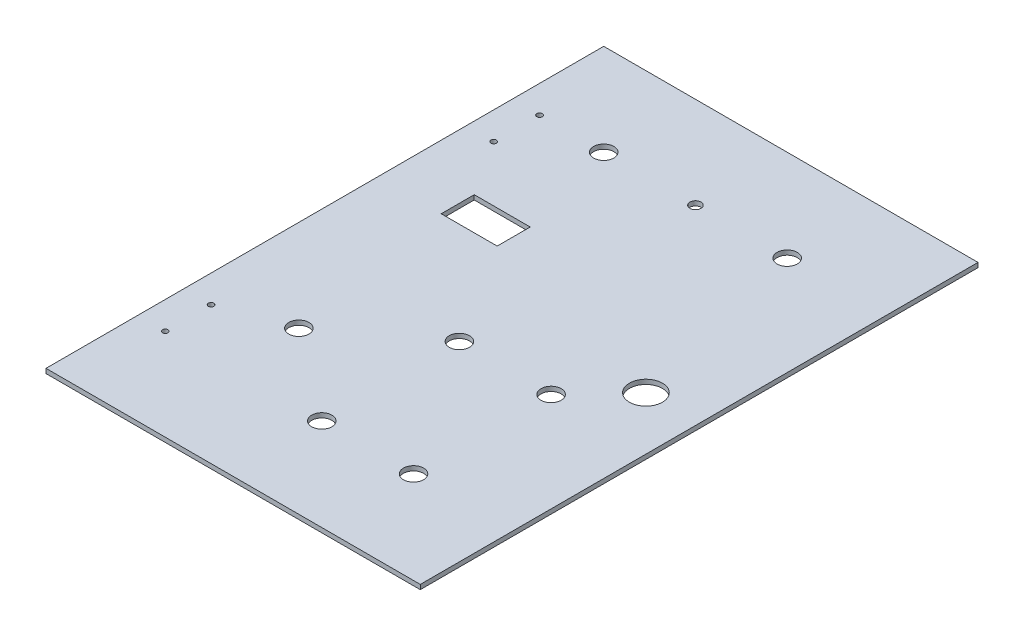
ISO-10303-21;
HEADER;
FILE_DESCRIPTION(('STEP AP214'),'2;1');
FILE_NAME('part.step','',(''),(''),'','','');
FILE_SCHEMA(('AUTOMOTIVE_DESIGN { 1 0 10303 214 1 1 1 1 }'));
ENDSEC;
DATA;
#1=APPLICATION_CONTEXT('core data for automotive mechanical design processes');
#2=APPLICATION_PROTOCOL_DEFINITION('international standard','automotive_design',2000,#1);
#3=PRODUCT_CONTEXT('',#1,'mechanical');
#4=PRODUCT('Part','Part','',(#3));
#5=PRODUCT_RELATED_PRODUCT_CATEGORY('part','',(#4));
#6=PRODUCT_DEFINITION_FORMATION('','',#4);
#7=PRODUCT_DEFINITION_CONTEXT('part definition',#1,'design');
#8=PRODUCT_DEFINITION('design','',#6,#7);
#9=PRODUCT_DEFINITION_SHAPE('','',#8);
#10=(LENGTH_UNIT() NAMED_UNIT(*) SI_UNIT(.MILLI.,.METRE.));
#11=(NAMED_UNIT(*) PLANE_ANGLE_UNIT() SI_UNIT($,.RADIAN.));
#12=(NAMED_UNIT(*) SI_UNIT($,.STERADIAN.) SOLID_ANGLE_UNIT());
#13=UNCERTAINTY_MEASURE_WITH_UNIT(LENGTH_MEASURE(1.E-05),#10,'distance_accuracy_value','');
#14=(GEOMETRIC_REPRESENTATION_CONTEXT(3) GLOBAL_UNCERTAINTY_ASSIGNED_CONTEXT((#13)) GLOBAL_UNIT_ASSIGNED_CONTEXT((#10,
#11,#12)) REPRESENTATION_CONTEXT('',''));
#15=CARTESIAN_POINT('',(0.,0.,0.));
#16=DIRECTION('',(0.,0.,1.));
#17=DIRECTION('',(1.,0.,0.));
#18=AXIS2_PLACEMENT_3D('',#15,#16,#17);
#19=CARTESIAN_POINT('',(-4.,21.6210946474568,-204.));
#20=DIRECTION('',(0.,-1.,0.));
#21=DIRECTION('',(0.,0.,-1.));
#22=AXIS2_PLACEMENT_3D('',#19,#20,#21);
#23=CYLINDRICAL_SURFACE('',#22,6.);
#24=CARTESIAN_POINT('',(-4.,0.,-204.));
#25=DIRECTION('',(0.,1.,0.));
#26=DIRECTION('',(0.,0.,-1.));
#27=AXIS2_PLACEMENT_3D('',#24,#25,#26);
#28=CIRCLE('',#27,6.);
#29=CARTESIAN_POINT('',(-4.,0.,-210.));
#30=VERTEX_POINT('',#29);
#31=EDGE_CURVE('E168',#30,#30,#28,.T.);
#32=ORIENTED_EDGE('',*,*,#31,.T.);
#33=EDGE_LOOP('',(#32));
#34=FACE_BOUND('',#33,.T.);
#35=CARTESIAN_POINT('',(-4.,-5.,-204.));
#36=DIRECTION('',(0.,1.,0.));
#37=DIRECTION('',(1.,0.,0.));
#38=AXIS2_PLACEMENT_3D('',#35,#36,#37);
#39=CIRCLE('',#38,6.);
#40=CARTESIAN_POINT('',(2.,-5.,-204.));
#41=VERTEX_POINT('',#40);
#42=EDGE_CURVE('E293',#41,#41,#39,.T.);
#43=ORIENTED_EDGE('',*,*,#42,.F.);
#44=EDGE_LOOP('',(#43));
#45=FACE_BOUND('',#44,.T.);
#46=ADVANCED_FACE('F15',(#34,#45),#23,.F.);
#47=CARTESIAN_POINT('',(146.,62.4678959301809,0.));
#48=DIRECTION('',(0.,-1.,0.));
#49=DIRECTION('',(0.,0.,-1.));
#50=AXIS2_PLACEMENT_3D('',#47,#48,#49);
#51=CYLINDRICAL_SURFACE('',#50,18.);
#52=CARTESIAN_POINT('',(146.,0.,0.));
#53=DIRECTION('',(0.,1.,0.));
#54=DIRECTION('',(0.,0.,-1.));
#55=AXIS2_PLACEMENT_3D('',#52,#53,#54);
#56=CIRCLE('',#55,18.);
#57=CARTESIAN_POINT('',(146.,0.,-18.));
#58=VERTEX_POINT('',#57);
#59=EDGE_CURVE('E181',#58,#58,#56,.T.);
#60=ORIENTED_EDGE('',*,*,#59,.T.);
#61=EDGE_LOOP('',(#60));
#62=FACE_BOUND('',#61,.T.);
#63=CARTESIAN_POINT('',(146.,-5.,0.));
#64=DIRECTION('',(0.,1.,0.));
#65=DIRECTION('',(1.,0.,0.));
#66=AXIS2_PLACEMENT_3D('',#63,#64,#65);
#67=CIRCLE('',#66,18.);
#68=CARTESIAN_POINT('',(164.,-5.,0.));
#69=VERTEX_POINT('',#68);
#70=EDGE_CURVE('E300',#69,#69,#67,.T.);
#71=ORIENTED_EDGE('',*,*,#70,.F.);
#72=EDGE_LOOP('',(#71));
#73=FACE_BOUND('',#72,.T.);
#74=ADVANCED_FACE('F283',(#62,#73),#51,.F.);
#75=CARTESIAN_POINT('',(96.,28.6663649179957,-204.));
#76=DIRECTION('',(0.,-1.,0.));
#77=DIRECTION('',(0.,0.,-1.));
#78=AXIS2_PLACEMENT_3D('',#75,#76,#77);
#79=CYLINDRICAL_SURFACE('',#78,11.);
#80=CARTESIAN_POINT('',(96.,0.,-204.));
#81=DIRECTION('',(0.,1.,0.));
#82=DIRECTION('',(0.,0.,-1.));
#83=AXIS2_PLACEMENT_3D('',#80,#81,#82);
#84=CIRCLE('',#83,11.);
#85=CARTESIAN_POINT('',(96.,0.,-215.));
#86=VERTEX_POINT('',#85);
#87=EDGE_CURVE('E184',#86,#86,#84,.T.);
#88=ORIENTED_EDGE('',*,*,#87,.T.);
#89=EDGE_LOOP('',(#88));
#90=FACE_BOUND('',#89,.T.);
#91=CARTESIAN_POINT('',(96.,-5.,-204.));
#92=DIRECTION('',(0.,1.,0.));
#93=DIRECTION('',(1.,0.,0.));
#94=AXIS2_PLACEMENT_3D('',#91,#92,#93);
#95=CIRCLE('',#94,11.);
#96=CARTESIAN_POINT('',(107.,-5.,-204.));
#97=VERTEX_POINT('',#96);
#98=EDGE_CURVE('E308',#97,#97,#95,.T.);
#99=ORIENTED_EDGE('',*,*,#98,.F.);
#100=EDGE_LOOP('',(#99));
#101=FACE_BOUND('',#100,.T.);
#102=ADVANCED_FACE('F287',(#90,#101),#79,.F.);
#103=CARTESIAN_POINT('',(-104.,55.4933006146598,-204.));
#104=DIRECTION('',(0.,-1.,0.));
#105=DIRECTION('',(0.,0.,-1.));
#106=AXIS2_PLACEMENT_3D('',#103,#104,#105);
#107=CYLINDRICAL_SURFACE('',#106,11.);
#108=CARTESIAN_POINT('',(-104.,0.,-204.));
#109=DIRECTION('',(0.,1.,0.));
#110=DIRECTION('',(0.,0.,-1.));
#111=AXIS2_PLACEMENT_3D('',#108,#109,#110);
#112=CIRCLE('',#111,11.);
#113=CARTESIAN_POINT('',(-104.,0.,-215.));
#114=VERTEX_POINT('',#113);
#115=EDGE_CURVE('E185',#114,#114,#112,.T.);
#116=ORIENTED_EDGE('',*,*,#115,.T.);
#117=EDGE_LOOP('',(#116));
#118=FACE_BOUND('',#117,.T.);
#119=CARTESIAN_POINT('',(-104.,-5.,-204.));
#120=DIRECTION('',(0.,1.,0.));
#121=DIRECTION('',(1.,0.,0.));
#122=AXIS2_PLACEMENT_3D('',#119,#120,#121);
#123=CIRCLE('',#122,11.);
#124=CARTESIAN_POINT('',(-93.,-5.,-204.));
#125=VERTEX_POINT('',#124);
#126=EDGE_CURVE('E315',#125,#125,#123,.T.);
#127=ORIENTED_EDGE('',*,*,#126,.F.);
#128=EDGE_LOOP('',(#127));
#129=FACE_BOUND('',#128,.T.);
#130=ADVANCED_FACE('F517',(#118,#129),#107,.F.);
#131=CARTESIAN_POINT('',(-174.,-23.3022716526502,-204.));
#132=DIRECTION('',(0.,1.,0.));
#133=DIRECTION('',(0.,0.,1.));
#134=AXIS2_PLACEMENT_3D('',#131,#132,#133);
#135=CYLINDRICAL_SURFACE('',#134,3.);
#136=CARTESIAN_POINT('',(-174.,0.,-204.));
#137=DIRECTION('',(0.,-1.,0.));
#138=DIRECTION('',(-1.,0.,0.));
#139=AXIS2_PLACEMENT_3D('',#136,#137,#138);
#140=CIRCLE('',#139,3.);
#141=CARTESIAN_POINT('',(-177.,0.,-204.));
#142=VERTEX_POINT('',#141);
#143=EDGE_CURVE('E188',#142,#142,#140,.T.);
#144=ORIENTED_EDGE('',*,*,#143,.F.);
#145=EDGE_LOOP('',(#144));
#146=FACE_BOUND('',#145,.T.);
#147=CARTESIAN_POINT('',(-174.,-5.,-204.));
#148=DIRECTION('',(0.,1.,0.));
#149=DIRECTION('',(0.,0.,-1.));
#150=AXIS2_PLACEMENT_3D('',#147,#148,#149);
#151=CIRCLE('',#150,3.);
#152=CARTESIAN_POINT('',(-174.,-5.,-207.));
#153=VERTEX_POINT('',#152);
#154=EDGE_CURVE('E319',#153,#153,#151,.T.);
#155=ORIENTED_EDGE('',*,*,#154,.F.);
#156=EDGE_LOOP('',(#155));
#157=FACE_BOUND('',#156,.T.);
#158=ADVANCED_FACE('F514',(#146,#157),#135,.F.);
#159=CARTESIAN_POINT('',(-174.,-23.7601065070478,-154.));
#160=DIRECTION('',(0.,1.,0.));
#161=DIRECTION('',(0.,0.,1.));
#162=AXIS2_PLACEMENT_3D('',#159,#160,#161);
#163=CYLINDRICAL_SURFACE('',#162,3.);
#164=CARTESIAN_POINT('',(-174.,0.,-154.));
#165=DIRECTION('',(0.,-1.,0.));
#166=DIRECTION('',(-1.,0.,0.));
#167=AXIS2_PLACEMENT_3D('',#164,#165,#166);
#168=CIRCLE('',#167,3.);
#169=CARTESIAN_POINT('',(-177.,0.,-154.));
#170=VERTEX_POINT('',#169);
#171=EDGE_CURVE('E193',#170,#170,#168,.T.);
#172=ORIENTED_EDGE('',*,*,#171,.F.);
#173=EDGE_LOOP('',(#172));
#174=FACE_BOUND('',#173,.T.);
#175=CARTESIAN_POINT('',(-174.,-5.,-154.));
#176=DIRECTION('',(0.,1.,0.));
#177=DIRECTION('',(0.,0.,-1.));
#178=AXIS2_PLACEMENT_3D('',#175,#176,#177);
#179=CIRCLE('',#178,3.);
#180=CARTESIAN_POINT('',(-174.,-5.,-157.));
#181=VERTEX_POINT('',#180);
#182=EDGE_CURVE('E323',#181,#181,#179,.T.);
#183=ORIENTED_EDGE('',*,*,#182,.F.);
#184=EDGE_LOOP('',(#183));
#185=FACE_BOUND('',#184,.T.);
#186=ADVANCED_FACE('F512',(#174,#185),#163,.F.);
#187=CARTESIAN_POINT('',(-174.,-23.6541691203319,154.));
#188=DIRECTION('',(0.,1.,0.));
#189=DIRECTION('',(0.,0.,1.));
#190=AXIS2_PLACEMENT_3D('',#187,#188,#189);
#191=CYLINDRICAL_SURFACE('',#190,3.);
#192=CARTESIAN_POINT('',(-174.,0.,154.));
#193=DIRECTION('',(0.,-1.,0.));
#194=DIRECTION('',(-1.,0.,0.));
#195=AXIS2_PLACEMENT_3D('',#192,#193,#194);
#196=CIRCLE('',#195,3.);
#197=CARTESIAN_POINT('',(-177.,0.,154.));
#198=VERTEX_POINT('',#197);
#199=EDGE_CURVE('E196',#198,#198,#196,.T.);
#200=ORIENTED_EDGE('',*,*,#199,.F.);
#201=EDGE_LOOP('',(#200));
#202=FACE_BOUND('',#201,.T.);
#203=CARTESIAN_POINT('',(-174.,-5.,154.));
#204=DIRECTION('',(0.,1.,0.));
#205=DIRECTION('',(0.,0.,-1.));
#206=AXIS2_PLACEMENT_3D('',#203,#204,#205);
#207=CIRCLE('',#206,3.);
#208=CARTESIAN_POINT('',(-174.,-5.,151.));
#209=VERTEX_POINT('',#208);
#210=EDGE_CURVE('E320',#209,#209,#207,.T.);
#211=ORIENTED_EDGE('',*,*,#210,.F.);
#212=EDGE_LOOP('',(#211));
#213=FACE_BOUND('',#212,.T.);
#214=ADVANCED_FACE('F508',(#202,#213),#191,.F.);
#215=CARTESIAN_POINT('',(-174.,-20.8355103007079,204.));
#216=DIRECTION('',(0.,1.,0.));
#217=DIRECTION('',(0.,0.,1.));
#218=AXIS2_PLACEMENT_3D('',#215,#216,#217);
#219=CYLINDRICAL_SURFACE('',#218,3.);
#220=CARTESIAN_POINT('',(-174.,0.,204.));
#221=DIRECTION('',(0.,-1.,0.));
#222=DIRECTION('',(-1.,0.,0.));
#223=AXIS2_PLACEMENT_3D('',#220,#221,#222);
#224=CIRCLE('',#223,3.);
#225=CARTESIAN_POINT('',(-177.,0.,204.));
#226=VERTEX_POINT('',#225);
#227=EDGE_CURVE('E199',#226,#226,#224,.T.);
#228=ORIENTED_EDGE('',*,*,#227,.F.);
#229=EDGE_LOOP('',(#228));
#230=FACE_BOUND('',#229,.T.);
#231=CARTESIAN_POINT('',(-174.,-5.,204.));
#232=DIRECTION('',(0.,1.,0.));
#233=DIRECTION('',(0.,0.,-1.));
#234=AXIS2_PLACEMENT_3D('',#231,#232,#233);
#235=CIRCLE('',#234,3.);
#236=CARTESIAN_POINT('',(-174.,-5.,201.));
#237=VERTEX_POINT('',#236);
#238=EDGE_CURVE('E253',#237,#237,#235,.T.);
#239=ORIENTED_EDGE('',*,*,#238,.F.);
#240=EDGE_LOOP('',(#239));
#241=FACE_BOUND('',#240,.T.);
#242=ADVANCED_FACE('F406',(#230,#241),#219,.F.);
#243=CARTESIAN_POINT('',(-104.,13.9804384099059,128.344438571223));
#244=DIRECTION('',(0.,-1.,0.));
#245=DIRECTION('',(0.,0.,-1.));
#246=AXIS2_PLACEMENT_3D('',#243,#244,#245);
#247=CYLINDRICAL_SURFACE('',#246,11.);
#248=CARTESIAN_POINT('',(-104.,0.,128.344438571223));
#249=DIRECTION('',(0.,1.,0.));
#250=DIRECTION('',(0.,0.,-1.));
#251=AXIS2_PLACEMENT_3D('',#248,#249,#250);
#252=CIRCLE('',#251,11.);
#253=CARTESIAN_POINT('',(-104.,0.,117.344438571223));
#254=VERTEX_POINT('',#253);
#255=EDGE_CURVE('E202',#254,#254,#252,.T.);
#256=ORIENTED_EDGE('',*,*,#255,.T.);
#257=EDGE_LOOP('',(#256));
#258=FACE_BOUND('',#257,.T.);
#259=CARTESIAN_POINT('',(-104.,-5.,128.344438571223));
#260=DIRECTION('',(0.,1.,0.));
#261=DIRECTION('',(1.,0.,0.));
#262=AXIS2_PLACEMENT_3D('',#259,#260,#261);
#263=CIRCLE('',#262,11.);
#264=CARTESIAN_POINT('',(-93.,-5.,128.344438571223));
#265=VERTEX_POINT('',#264);
#266=EDGE_CURVE('E255',#265,#265,#263,.T.);
#267=ORIENTED_EDGE('',*,*,#266,.F.);
#268=EDGE_LOOP('',(#267));
#269=FACE_BOUND('',#268,.T.);
#270=ADVANCED_FACE('F402',(#258,#269),#247,.F.);
#271=CARTESIAN_POINT('',(96.,29.0395615849271,53.3444385712235));
#272=DIRECTION('',(0.,-1.,0.));
#273=DIRECTION('',(0.,0.,-1.));
#274=AXIS2_PLACEMENT_3D('',#271,#272,#273);
#275=CYLINDRICAL_SURFACE('',#274,11.);
#276=CARTESIAN_POINT('',(96.,0.,53.3444385712235));
#277=DIRECTION('',(0.,1.,0.));
#278=DIRECTION('',(0.,0.,-1.));
#279=AXIS2_PLACEMENT_3D('',#276,#277,#278);
#280=CIRCLE('',#279,11.);
#281=CARTESIAN_POINT('',(96.,0.,42.3444385712235));
#282=VERTEX_POINT('',#281);
#283=EDGE_CURVE('E203',#282,#282,#280,.T.);
#284=ORIENTED_EDGE('',*,*,#283,.T.);
#285=EDGE_LOOP('',(#284));
#286=FACE_BOUND('',#285,.T.);
#287=CARTESIAN_POINT('',(96.,-5.,53.3444385712235));
#288=DIRECTION('',(0.,1.,0.));
#289=DIRECTION('',(-1.,0.,0.));
#290=AXIS2_PLACEMENT_3D('',#287,#288,#289);
#291=CIRCLE('',#290,11.);
#292=CARTESIAN_POINT('',(85.,-5.,53.3444385712235));
#293=VERTEX_POINT('',#292);
#294=EDGE_CURVE('E259',#293,#293,#291,.T.);
#295=ORIENTED_EDGE('',*,*,#294,.F.);
#296=EDGE_LOOP('',(#295));
#297=FACE_BOUND('',#296,.T.);
#298=ADVANCED_FACE('F405',(#286,#297),#275,.F.);
#299=CARTESIAN_POINT('',(-4.,98.1331984889527,53.3444385712235));
#300=DIRECTION('',(0.,-1.,0.));
#301=DIRECTION('',(0.,0.,-1.));
#302=AXIS2_PLACEMENT_3D('',#299,#300,#301);
#303=CYLINDRICAL_SURFACE('',#302,11.);
#304=CARTESIAN_POINT('',(-4.,0.,53.3444385712235));
#305=DIRECTION('',(0.,1.,0.));
#306=DIRECTION('',(0.,0.,-1.));
#307=AXIS2_PLACEMENT_3D('',#304,#305,#306);
#308=CIRCLE('',#307,11.);
#309=CARTESIAN_POINT('',(-4.,0.,42.3444385712235));
#310=VERTEX_POINT('',#309);
#311=EDGE_CURVE('E207',#310,#310,#308,.T.);
#312=ORIENTED_EDGE('',*,*,#311,.T.);
#313=EDGE_LOOP('',(#312));
#314=FACE_BOUND('',#313,.T.);
#315=CARTESIAN_POINT('',(-4.,-5.,53.3444385712235));
#316=DIRECTION('',(0.,1.,0.));
#317=DIRECTION('',(1.,0.,0.));
#318=AXIS2_PLACEMENT_3D('',#315,#316,#317);
#319=CIRCLE('',#318,11.);
#320=CARTESIAN_POINT('',(7.,-5.,53.3444385712235));
#321=VERTEX_POINT('',#320);
#322=EDGE_CURVE('E263',#321,#321,#319,.T.);
#323=ORIENTED_EDGE('',*,*,#322,.F.);
#324=EDGE_LOOP('',(#323));
#325=FACE_BOUND('',#324,.T.);
#326=ADVANCED_FACE('F499',(#314,#325),#303,.F.);
#327=CARTESIAN_POINT('',(96.,58.7076540386802,203.344438571223));
#328=DIRECTION('',(0.,-1.,0.));
#329=DIRECTION('',(0.,0.,-1.));
#330=AXIS2_PLACEMENT_3D('',#327,#328,#329);
#331=CYLINDRICAL_SURFACE('',#330,11.);
#332=CARTESIAN_POINT('',(96.,0.,203.344438571223));
#333=DIRECTION('',(0.,1.,0.));
#334=DIRECTION('',(0.,0.,-1.));
#335=AXIS2_PLACEMENT_3D('',#332,#333,#334);
#336=CIRCLE('',#335,11.);
#337=CARTESIAN_POINT('',(96.,0.,192.344438571223));
#338=VERTEX_POINT('',#337);
#339=EDGE_CURVE('E149',#338,#338,#336,.T.);
#340=ORIENTED_EDGE('',*,*,#339,.T.);
#341=EDGE_LOOP('',(#340));
#342=FACE_BOUND('',#341,.T.);
#343=CARTESIAN_POINT('',(96.,-5.,203.344438571223));
#344=DIRECTION('',(0.,1.,0.));
#345=DIRECTION('',(1.,0.,0.));
#346=AXIS2_PLACEMENT_3D('',#343,#344,#345);
#347=CIRCLE('',#346,11.);
#348=CARTESIAN_POINT('',(107.,-5.,203.344438571223));
#349=VERTEX_POINT('',#348);
#350=EDGE_CURVE('E267',#349,#349,#347,.T.);
#351=ORIENTED_EDGE('',*,*,#350,.F.);
#352=EDGE_LOOP('',(#351));
#353=FACE_BOUND('',#352,.T.);
#354=ADVANCED_FACE('F214',(#342,#353),#331,.F.);
#355=CARTESIAN_POINT('',(-4.,71.844398148231,203.344438571223));
#356=DIRECTION('',(0.,-1.,0.));
#357=DIRECTION('',(0.,0.,-1.));
#358=AXIS2_PLACEMENT_3D('',#355,#356,#357);
#359=CYLINDRICAL_SURFACE('',#358,11.);
#360=CARTESIAN_POINT('',(-4.,0.,203.344438571223));
#361=DIRECTION('',(0.,1.,0.));
#362=DIRECTION('',(0.,0.,-1.));
#363=AXIS2_PLACEMENT_3D('',#360,#361,#362);
#364=CIRCLE('',#363,11.);
#365=CARTESIAN_POINT('',(-4.,0.,192.344438571223));
#366=VERTEX_POINT('',#365);
#367=EDGE_CURVE('E141',#366,#366,#364,.T.);
#368=ORIENTED_EDGE('',*,*,#367,.T.);
#369=EDGE_LOOP('',(#368));
#370=FACE_BOUND('',#369,.T.);
#371=CARTESIAN_POINT('',(-4.,-5.,203.344438571223));
#372=DIRECTION('',(0.,1.,0.));
#373=DIRECTION('',(1.,0.,0.));
#374=AXIS2_PLACEMENT_3D('',#371,#372,#373);
#375=CIRCLE('',#374,11.);
#376=CARTESIAN_POINT('',(7.,-5.,203.344438571223));
#377=VERTEX_POINT('',#376);
#378=EDGE_CURVE('E268',#377,#377,#375,.T.);
#379=ORIENTED_EDGE('',*,*,#378,.F.);
#380=EDGE_LOOP('',(#379));
#381=FACE_BOUND('',#380,.T.);
#382=ADVANCED_FACE('F490',(#370,#381),#359,.F.);
#383=CARTESIAN_POINT('',(-134.5,16.8564432523772,-93.3277807143883));
#384=DIRECTION('',(0.,0.,-1.));
#385=DIRECTION('',(-1.,0.,0.));
#386=AXIS2_PLACEMENT_3D('',#383,#384,#385);
#387=PLANE('',#386);
#388=DIRECTION('',(0.,-1.,0.));
#389=VECTOR('',#388,1.);
#390=CARTESIAN_POINT('',(-134.5,16.8564432523772,-93.3277807143883));
#391=LINE('',#390,#389);
#392=CARTESIAN_POINT('',(-134.5,0.,-93.3277807143883));
#393=VERTEX_POINT('',#392);
#394=CARTESIAN_POINT('',(-134.5,-5.,-93.3277807143883));
#395=VERTEX_POINT('',#394);
#396=EDGE_CURVE('E10',#393,#395,#391,.T.);
#397=ORIENTED_EDGE('',*,*,#396,.T.);
#398=DIRECTION('',(1.,0.,0.));
#399=VECTOR('',#398,1.);
#400=CARTESIAN_POINT('',(-134.5,-5.,-93.3277807143883));
#401=LINE('',#400,#399);
#402=CARTESIAN_POINT('',(-73.5,-5.,-93.3277807143883));
#403=VERTEX_POINT('',#402);
#404=EDGE_CURVE('E172',#395,#403,#401,.T.);
#405=ORIENTED_EDGE('',*,*,#404,.T.);
#406=DIRECTION('',(0.,-1.,0.));
#407=VECTOR('',#406,1.);
#408=CARTESIAN_POINT('',(-73.5,16.8564432523772,-93.3277807143883));
#409=LINE('',#408,#407);
#410=CARTESIAN_POINT('',(-73.5,0.,-93.3277807143883));
#411=VERTEX_POINT('',#410);
#412=EDGE_CURVE('E136',#411,#403,#409,.T.);
#413=ORIENTED_EDGE('',*,*,#412,.F.);
#414=DIRECTION('',(1.,0.,0.));
#415=VECTOR('',#414,1.);
#416=CARTESIAN_POINT('',(0.,0.,-93.3277807143883));
#417=LINE('',#416,#415);
#418=EDGE_CURVE('E133',#393,#411,#417,.T.);
#419=ORIENTED_EDGE('',*,*,#418,.F.);
#420=EDGE_LOOP('',(#397,#405,#413,#419));
#421=FACE_BOUND('',#420,.T.);
#422=ADVANCED_FACE('F138',(#421),#387,.F.);
#423=CARTESIAN_POINT('',(-134.5,16.8564432523772,-57.3277807143883));
#424=DIRECTION('',(-1.,0.,0.));
#425=DIRECTION('',(0.,0.,1.));
#426=AXIS2_PLACEMENT_3D('',#423,#424,#425);
#427=PLANE('',#426);
#428=DIRECTION('',(0.,-1.,0.));
#429=VECTOR('',#428,1.);
#430=CARTESIAN_POINT('',(-134.5,16.8564432523772,-57.3277807143883));
#431=LINE('',#430,#429);
#432=CARTESIAN_POINT('',(-134.5,0.,-57.3277807143883));
#433=VERTEX_POINT('',#432);
#434=CARTESIAN_POINT('',(-134.5,-5.,-57.3277807143883));
#435=VERTEX_POINT('',#434);
#436=EDGE_CURVE('E18',#433,#435,#431,.T.);
#437=ORIENTED_EDGE('',*,*,#436,.T.);
#438=DIRECTION('',(0.,0.,-1.));
#439=VECTOR('',#438,1.);
#440=CARTESIAN_POINT('',(-134.5,-5.,-57.3277807143883));
#441=LINE('',#440,#439);
#442=EDGE_CURVE('E123',#435,#395,#441,.T.);
#443=ORIENTED_EDGE('',*,*,#442,.T.);
#444=ORIENTED_EDGE('',*,*,#396,.F.);
#445=DIRECTION('',(0.,0.,-1.));
#446=VECTOR('',#445,1.);
#447=CARTESIAN_POINT('',(-134.5,0.,0.));
#448=LINE('',#447,#446);
#449=EDGE_CURVE('E120',#433,#393,#448,.T.);
#450=ORIENTED_EDGE('',*,*,#449,.F.);
#451=EDGE_LOOP('',(#437,#443,#444,#450));
#452=FACE_BOUND('',#451,.T.);
#453=ADVANCED_FACE('F119',(#452),#427,.F.);
#454=CARTESIAN_POINT('',(-104.,16.8564432523772,-57.3277807143883));
#455=DIRECTION('',(0.,0.,1.));
#456=DIRECTION('',(1.,0.,0.));
#457=AXIS2_PLACEMENT_3D('',#454,#455,#456);
#458=PLANE('',#457);
#459=DIRECTION('',(0.,-1.,0.));
#460=VECTOR('',#459,1.);
#461=CARTESIAN_POINT('',(-73.5,16.8564432523772,-57.3277807143883));
#462=LINE('',#461,#460);
#463=CARTESIAN_POINT('',(-73.5,0.,-57.3277807143883));
#464=VERTEX_POINT('',#463);
#465=CARTESIAN_POINT('',(-73.5,-5.,-57.3277807143883));
#466=VERTEX_POINT('',#465);
#467=EDGE_CURVE('E48',#464,#466,#462,.T.);
#468=ORIENTED_EDGE('',*,*,#467,.T.);
#469=DIRECTION('',(-1.,0.,0.));
#470=VECTOR('',#469,1.);
#471=CARTESIAN_POINT('',(-104.,-5.,-57.3277807143883));
#472=LINE('',#471,#470);
#473=EDGE_CURVE('E163',#466,#435,#472,.T.);
#474=ORIENTED_EDGE('',*,*,#473,.T.);
#475=ORIENTED_EDGE('',*,*,#436,.F.);
#476=DIRECTION('',(-1.,0.,0.));
#477=VECTOR('',#476,1.);
#478=CARTESIAN_POINT('',(0.,0.,-57.3277807143883));
#479=LINE('',#478,#477);
#480=EDGE_CURVE('E134',#464,#433,#479,.T.);
#481=ORIENTED_EDGE('',*,*,#480,.F.);
#482=EDGE_LOOP('',(#468,#474,#475,#481));
#483=FACE_BOUND('',#482,.T.);
#484=ADVANCED_FACE('F164',(#483),#458,.F.);
#485=CARTESIAN_POINT('',(-73.5,16.8564432523772,-93.3277807143883));
#486=DIRECTION('',(1.,0.,0.));
#487=DIRECTION('',(0.,1.,0.));
#488=AXIS2_PLACEMENT_3D('',#485,#486,#487);
#489=PLANE('',#488);
#490=ORIENTED_EDGE('',*,*,#412,.T.);
#491=DIRECTION('',(0.,0.,1.));
#492=VECTOR('',#491,1.);
#493=CARTESIAN_POINT('',(-73.5,-5.,-93.3277807143883));
#494=LINE('',#493,#492);
#495=EDGE_CURVE('E178',#403,#466,#494,.T.);
#496=ORIENTED_EDGE('',*,*,#495,.T.);
#497=ORIENTED_EDGE('',*,*,#467,.F.);
#498=DIRECTION('',(0.,0.,1.));
#499=VECTOR('',#498,1.);
#500=CARTESIAN_POINT('',(-73.5,0.,0.));
#501=LINE('',#500,#499);
#502=EDGE_CURVE('E140',#411,#464,#501,.T.);
#503=ORIENTED_EDGE('',*,*,#502,.F.);
#504=EDGE_LOOP('',(#490,#496,#497,#503));
#505=FACE_BOUND('',#504,.T.);
#506=ADVANCED_FACE('F219',(#505),#489,.F.);
#507=CARTESIAN_POINT('',(0.,0.,0.));
#508=DIRECTION('',(0.,-1.,0.));
#509=DIRECTION('',(0.,0.,-1.));
#510=AXIS2_PLACEMENT_3D('',#507,#508,#509);
#511=PLANE('',#510);
#512=DIRECTION('',(1.,0.,0.));
#513=VECTOR('',#512,1.);
#514=CARTESIAN_POINT('',(-204.,0.,-304.));
#515=LINE('',#514,#513);
#516=CARTESIAN_POINT('',(-204.,0.,-304.));
#517=VERTEX_POINT('',#516);
#518=CARTESIAN_POINT('',(204.,0.,-304.));
#519=VERTEX_POINT('',#518);
#520=EDGE_CURVE('E367',#517,#519,#515,.T.);
#521=ORIENTED_EDGE('',*,*,#520,.F.);
#522=DIRECTION('',(0.,0.,-1.));
#523=VECTOR('',#522,1.);
#524=CARTESIAN_POINT('',(-204.,0.,304.));
#525=LINE('',#524,#523);
#526=CARTESIAN_POINT('',(-204.,0.,304.));
#527=VERTEX_POINT('',#526);
#528=EDGE_CURVE('E311',#527,#517,#525,.T.);
#529=ORIENTED_EDGE('',*,*,#528,.F.);
#530=DIRECTION('',(-1.,0.,0.));
#531=VECTOR('',#530,1.);
#532=CARTESIAN_POINT('',(204.,0.,304.));
#533=LINE('',#532,#531);
#534=CARTESIAN_POINT('',(204.,0.,304.));
#535=VERTEX_POINT('',#534);
#536=EDGE_CURVE('E340',#535,#527,#533,.T.);
#537=ORIENTED_EDGE('',*,*,#536,.F.);
#538=DIRECTION('',(0.,0.,1.));
#539=VECTOR('',#538,1.);
#540=CARTESIAN_POINT('',(204.,0.,-304.));
#541=LINE('',#540,#539);
#542=EDGE_CURVE('E386',#519,#535,#541,.T.);
#543=ORIENTED_EDGE('',*,*,#542,.F.);
#544=EDGE_LOOP('',(#521,#529,#537,#543));
#545=FACE_BOUND('',#544,.T.);
#546=ORIENTED_EDGE('',*,*,#418,.T.);
#547=ORIENTED_EDGE('',*,*,#502,.T.);
#548=ORIENTED_EDGE('',*,*,#480,.T.);
#549=ORIENTED_EDGE('',*,*,#449,.T.);
#550=EDGE_LOOP('',(#546,#547,#548,#549));
#551=FACE_BOUND('',#550,.T.);
#552=ORIENTED_EDGE('',*,*,#367,.F.);
#553=EDGE_LOOP('',(#552));
#554=FACE_BOUND('',#553,.T.);
#555=ORIENTED_EDGE('',*,*,#339,.F.);
#556=EDGE_LOOP('',(#555));
#557=FACE_BOUND('',#556,.T.);
#558=ORIENTED_EDGE('',*,*,#311,.F.);
#559=EDGE_LOOP('',(#558));
#560=FACE_BOUND('',#559,.T.);
#561=ORIENTED_EDGE('',*,*,#283,.F.);
#562=EDGE_LOOP('',(#561));
#563=FACE_BOUND('',#562,.T.);
#564=ORIENTED_EDGE('',*,*,#255,.F.);
#565=EDGE_LOOP('',(#564));
#566=FACE_BOUND('',#565,.T.);
#567=ORIENTED_EDGE('',*,*,#227,.T.);
#568=EDGE_LOOP('',(#567));
#569=FACE_BOUND('',#568,.T.);
#570=ORIENTED_EDGE('',*,*,#199,.T.);
#571=EDGE_LOOP('',(#570));
#572=FACE_BOUND('',#571,.T.);
#573=ORIENTED_EDGE('',*,*,#171,.T.);
#574=EDGE_LOOP('',(#573));
#575=FACE_BOUND('',#574,.T.);
#576=ORIENTED_EDGE('',*,*,#143,.T.);
#577=EDGE_LOOP('',(#576));
#578=FACE_BOUND('',#577,.T.);
#579=ORIENTED_EDGE('',*,*,#115,.F.);
#580=EDGE_LOOP('',(#579));
#581=FACE_BOUND('',#580,.T.);
#582=ORIENTED_EDGE('',*,*,#87,.F.);
#583=EDGE_LOOP('',(#582));
#584=FACE_BOUND('',#583,.T.);
#585=ORIENTED_EDGE('',*,*,#59,.F.);
#586=EDGE_LOOP('',(#585));
#587=FACE_BOUND('',#586,.T.);
#588=ORIENTED_EDGE('',*,*,#31,.F.);
#589=EDGE_LOOP('',(#588));
#590=FACE_BOUND('',#589,.T.);
#591=ADVANCED_FACE('F130',(#545,#551,#554,#557,#560,#563,#566,#569,#572,#575,#578,#581,#584,
#587,#590),#511,.F.);
#592=CARTESIAN_POINT('',(0.,-5.,0.));
#593=DIRECTION('',(0.,-1.,0.));
#594=DIRECTION('',(0.,0.,-1.));
#595=AXIS2_PLACEMENT_3D('',#592,#593,#594);
#596=PLANE('',#595);
#597=DIRECTION('',(1.,0.,0.));
#598=VECTOR('',#597,1.);
#599=CARTESIAN_POINT('',(-204.,-5.,-304.));
#600=LINE('',#599,#598);
#601=CARTESIAN_POINT('',(-204.,-5.,-304.));
#602=VERTEX_POINT('',#601);
#603=CARTESIAN_POINT('',(204.,-5.,-304.));
#604=VERTEX_POINT('',#603);
#605=EDGE_CURVE('E375',#602,#604,#600,.T.);
#606=ORIENTED_EDGE('',*,*,#605,.T.);
#607=DIRECTION('',(0.,0.,1.));
#608=VECTOR('',#607,1.);
#609=CARTESIAN_POINT('',(204.,-5.,-304.));
#610=LINE('',#609,#608);
#611=CARTESIAN_POINT('',(204.,-5.,304.));
#612=VERTEX_POINT('',#611);
#613=EDGE_CURVE('E365',#604,#612,#610,.T.);
#614=ORIENTED_EDGE('',*,*,#613,.T.);
#615=DIRECTION('',(-1.,0.,0.));
#616=VECTOR('',#615,1.);
#617=CARTESIAN_POINT('',(204.,-5.,304.));
#618=LINE('',#617,#616);
#619=CARTESIAN_POINT('',(-204.,-5.,304.));
#620=VERTEX_POINT('',#619);
#621=EDGE_CURVE('E342',#612,#620,#618,.T.);
#622=ORIENTED_EDGE('',*,*,#621,.T.);
#623=DIRECTION('',(0.,0.,-1.));
#624=VECTOR('',#623,1.);
#625=CARTESIAN_POINT('',(-204.,-5.,304.));
#626=LINE('',#625,#624);
#627=EDGE_CURVE('E301',#620,#602,#626,.T.);
#628=ORIENTED_EDGE('',*,*,#627,.T.);
#629=EDGE_LOOP('',(#606,#614,#622,#628));
#630=FACE_BOUND('',#629,.T.);
#631=ORIENTED_EDGE('',*,*,#495,.F.);
#632=ORIENTED_EDGE('',*,*,#404,.F.);
#633=ORIENTED_EDGE('',*,*,#442,.F.);
#634=ORIENTED_EDGE('',*,*,#473,.F.);
#635=EDGE_LOOP('',(#631,#632,#633,#634));
#636=FACE_BOUND('',#635,.T.);
#637=ORIENTED_EDGE('',*,*,#378,.T.);
#638=EDGE_LOOP('',(#637));
#639=FACE_BOUND('',#638,.T.);
#640=ORIENTED_EDGE('',*,*,#350,.T.);
#641=EDGE_LOOP('',(#640));
#642=FACE_BOUND('',#641,.T.);
#643=ORIENTED_EDGE('',*,*,#322,.T.);
#644=EDGE_LOOP('',(#643));
#645=FACE_BOUND('',#644,.T.);
#646=ORIENTED_EDGE('',*,*,#294,.T.);
#647=EDGE_LOOP('',(#646));
#648=FACE_BOUND('',#647,.T.);
#649=ORIENTED_EDGE('',*,*,#266,.T.);
#650=EDGE_LOOP('',(#649));
#651=FACE_BOUND('',#650,.T.);
#652=ORIENTED_EDGE('',*,*,#238,.T.);
#653=EDGE_LOOP('',(#652));
#654=FACE_BOUND('',#653,.T.);
#655=ORIENTED_EDGE('',*,*,#210,.T.);
#656=EDGE_LOOP('',(#655));
#657=FACE_BOUND('',#656,.T.);
#658=ORIENTED_EDGE('',*,*,#182,.T.);
#659=EDGE_LOOP('',(#658));
#660=FACE_BOUND('',#659,.T.);
#661=ORIENTED_EDGE('',*,*,#154,.T.);
#662=EDGE_LOOP('',(#661));
#663=FACE_BOUND('',#662,.T.);
#664=ORIENTED_EDGE('',*,*,#126,.T.);
#665=EDGE_LOOP('',(#664));
#666=FACE_BOUND('',#665,.T.);
#667=ORIENTED_EDGE('',*,*,#98,.T.);
#668=EDGE_LOOP('',(#667));
#669=FACE_BOUND('',#668,.T.);
#670=ORIENTED_EDGE('',*,*,#70,.T.);
#671=EDGE_LOOP('',(#670));
#672=FACE_BOUND('',#671,.T.);
#673=ORIENTED_EDGE('',*,*,#42,.T.);
#674=EDGE_LOOP('',(#673));
#675=FACE_BOUND('',#674,.T.);
#676=ADVANCED_FACE('F170',(#630,#636,#639,#642,#645,#648,#651,#654,#657,#660,#663,#666,#669,
#672,#675),#596,.T.);
#677=CARTESIAN_POINT('',(-204.,-5.,304.));
#678=DIRECTION('',(1.,0.,0.));
#679=DIRECTION('',(0.,1.,0.));
#680=AXIS2_PLACEMENT_3D('',#677,#678,#679);
#681=PLANE('',#680);
#682=ORIENTED_EDGE('',*,*,#528,.T.);
#683=DIRECTION('',(0.,1.,0.));
#684=VECTOR('',#683,1.);
#685=CARTESIAN_POINT('',(-204.,-5.,-304.));
#686=LINE('',#685,#684);
#687=EDGE_CURVE('E379',#602,#517,#686,.T.);
#688=ORIENTED_EDGE('',*,*,#687,.F.);
#689=ORIENTED_EDGE('',*,*,#627,.F.);
#690=DIRECTION('',(0.,1.,0.));
#691=VECTOR('',#690,1.);
#692=CARTESIAN_POINT('',(-204.,-5.,304.));
#693=LINE('',#692,#691);
#694=EDGE_CURVE('E345',#620,#527,#693,.T.);
#695=ORIENTED_EDGE('',*,*,#694,.T.);
#696=EDGE_LOOP('',(#682,#688,#689,#695));
#697=FACE_BOUND('',#696,.T.);
#698=ADVANCED_FACE('F417',(#697),#681,.F.);
#699=CARTESIAN_POINT('',(204.,-5.,304.));
#700=DIRECTION('',(0.,0.,-1.));
#701=DIRECTION('',(0.,-1.,0.));
#702=AXIS2_PLACEMENT_3D('',#699,#700,#701);
#703=PLANE('',#702);
#704=ORIENTED_EDGE('',*,*,#536,.T.);
#705=ORIENTED_EDGE('',*,*,#694,.F.);
#706=ORIENTED_EDGE('',*,*,#621,.F.);
#707=DIRECTION('',(0.,1.,0.));
#708=VECTOR('',#707,1.);
#709=CARTESIAN_POINT('',(204.,-5.,304.));
#710=LINE('',#709,#708);
#711=EDGE_CURVE('E393',#612,#535,#710,.T.);
#712=ORIENTED_EDGE('',*,*,#711,.T.);
#713=EDGE_LOOP('',(#704,#705,#706,#712));
#714=FACE_BOUND('',#713,.T.);
#715=ADVANCED_FACE('F644',(#714),#703,.F.);
#716=CARTESIAN_POINT('',(204.,-5.,-304.));
#717=DIRECTION('',(-1.,0.,0.));
#718=DIRECTION('',(0.,0.,1.));
#719=AXIS2_PLACEMENT_3D('',#716,#717,#718);
#720=PLANE('',#719);
#721=ORIENTED_EDGE('',*,*,#542,.T.);
#722=ORIENTED_EDGE('',*,*,#711,.F.);
#723=ORIENTED_EDGE('',*,*,#613,.F.);
#724=DIRECTION('',(0.,1.,0.));
#725=VECTOR('',#724,1.);
#726=CARTESIAN_POINT('',(204.,-5.,-304.));
#727=LINE('',#726,#725);
#728=EDGE_CURVE('E371',#604,#519,#727,.T.);
#729=ORIENTED_EDGE('',*,*,#728,.T.);
#730=EDGE_LOOP('',(#721,#722,#723,#729));
#731=FACE_BOUND('',#730,.T.);
#732=ADVANCED_FACE('F654',(#731),#720,.F.);
#733=CARTESIAN_POINT('',(-204.,-5.,-304.));
#734=DIRECTION('',(0.,0.,1.));
#735=DIRECTION('',(1.,0.,0.));
#736=AXIS2_PLACEMENT_3D('',#733,#734,#735);
#737=PLANE('',#736);
#738=ORIENTED_EDGE('',*,*,#520,.T.);
#739=ORIENTED_EDGE('',*,*,#728,.F.);
#740=ORIENTED_EDGE('',*,*,#605,.F.);
#741=ORIENTED_EDGE('',*,*,#687,.T.);
#742=EDGE_LOOP('',(#738,#739,#740,#741));
#743=FACE_BOUND('',#742,.T.);
#744=ADVANCED_FACE('F664',(#743),#737,.F.);
#745=CLOSED_SHELL('',(#46,#74,#102,#130,#158,#186,#214,#242,#270,#298,#326,#354,#382,#422,#453,
#484,#506,#591,#676,#698,#715,#732,#744));
#746=MANIFOLD_SOLID_BREP('B1',#745);
#747=ADVANCED_BREP_SHAPE_REPRESENTATION('',(#18,#746),#14);
#748=SHAPE_DEFINITION_REPRESENTATION(#9,#747);
ENDSEC;
END-ISO-10303-21;
